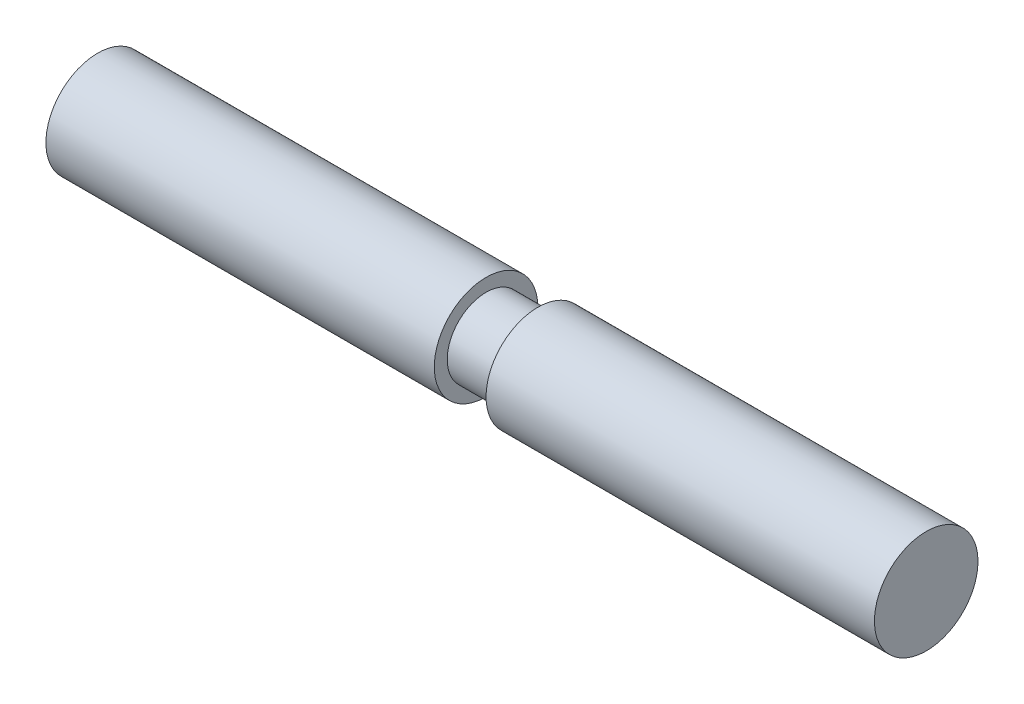
ISO-10303-21;
HEADER;
FILE_DESCRIPTION(('STEP AP214'),'2;1');
FILE_NAME('part.step','',(''),(''),'','','');
FILE_SCHEMA(('AUTOMOTIVE_DESIGN { 1 0 10303 214 1 1 1 1 }'));
ENDSEC;
DATA;
#1=APPLICATION_CONTEXT('core data for automotive mechanical design processes');
#2=APPLICATION_PROTOCOL_DEFINITION('international standard','automotive_design',2000,#1);
#3=PRODUCT_CONTEXT('',#1,'mechanical');
#4=PRODUCT('Part','Part','',(#3));
#5=PRODUCT_RELATED_PRODUCT_CATEGORY('part','',(#4));
#6=PRODUCT_DEFINITION_FORMATION('','',#4);
#7=PRODUCT_DEFINITION_CONTEXT('part definition',#1,'design');
#8=PRODUCT_DEFINITION('design','',#6,#7);
#9=PRODUCT_DEFINITION_SHAPE('','',#8);
#10=(LENGTH_UNIT() NAMED_UNIT(*) SI_UNIT(.MILLI.,.METRE.));
#11=(NAMED_UNIT(*) PLANE_ANGLE_UNIT() SI_UNIT($,.RADIAN.));
#12=(NAMED_UNIT(*) SI_UNIT($,.STERADIAN.) SOLID_ANGLE_UNIT());
#13=UNCERTAINTY_MEASURE_WITH_UNIT(LENGTH_MEASURE(1.E-05),#10,'distance_accuracy_value','');
#14=(GEOMETRIC_REPRESENTATION_CONTEXT(3) GLOBAL_UNCERTAINTY_ASSIGNED_CONTEXT((#13)) GLOBAL_UNIT_ASSIGNED_CONTEXT((#10,
#11,#12)) REPRESENTATION_CONTEXT('',''));
#15=CARTESIAN_POINT('',(0.,0.,0.));
#16=DIRECTION('',(0.,0.,1.));
#17=DIRECTION('',(1.,0.,0.));
#18=AXIS2_PLACEMENT_3D('',#15,#16,#17);
#19=CARTESIAN_POINT('',(-72.,0.,0.));
#20=DIRECTION('',(1.,0.,0.));
#21=DIRECTION('',(0.,0.,-1.));
#22=AXIS2_PLACEMENT_3D('',#19,#20,#21);
#23=CYLINDRICAL_SURFACE('',#22,6.);
#24=CARTESIAN_POINT('',(-72.,0.,0.));
#25=DIRECTION('',(1.,0.,0.));
#26=DIRECTION('',(0.,0.,-1.));
#27=AXIS2_PLACEMENT_3D('',#24,#25,#26);
#28=CIRCLE('',#27,6.);
#29=CARTESIAN_POINT('',(-72.,0.,-6.));
#30=VERTEX_POINT('',#29);
#31=EDGE_CURVE('E10',#30,#30,#28,.T.);
#32=ORIENTED_EDGE('',*,*,#31,.T.);
#33=EDGE_LOOP('',(#32));
#34=FACE_BOUND('',#33,.T.);
#35=CARTESIAN_POINT('',(-27.,0.,0.));
#36=DIRECTION('',(1.,0.,0.));
#37=DIRECTION('',(0.,0.,-1.));
#38=AXIS2_PLACEMENT_3D('',#35,#36,#37);
#39=CIRCLE('',#38,6.);
#40=CARTESIAN_POINT('',(-27.,0.,-6.));
#41=VERTEX_POINT('',#40);
#42=EDGE_CURVE('E35',#41,#41,#39,.F.);
#43=ORIENTED_EDGE('',*,*,#42,.T.);
#44=EDGE_LOOP('',(#43));
#45=FACE_BOUND('',#44,.T.);
#46=ADVANCED_FACE('F31',(#34,#45),#23,.T.);
#47=CARTESIAN_POINT('',(-72.,0.,0.));
#48=DIRECTION('',(1.,0.,0.));
#49=DIRECTION('',(0.,0.,-1.));
#50=AXIS2_PLACEMENT_3D('',#47,#48,#49);
#51=PLANE('',#50);
#52=ORIENTED_EDGE('',*,*,#31,.F.);
#53=EDGE_LOOP('',(#52));
#54=FACE_BOUND('',#53,.T.);
#55=ADVANCED_FACE('F75',(#54),#51,.F.);
#56=CARTESIAN_POINT('',(-27.,0.,0.));
#57=DIRECTION('',(1.,0.,0.));
#58=DIRECTION('',(0.,0.,-1.));
#59=AXIS2_PLACEMENT_3D('',#56,#57,#58);
#60=PLANE('',#59);
#61=ORIENTED_EDGE('',*,*,#42,.F.);
#62=EDGE_LOOP('',(#61));
#63=FACE_BOUND('',#62,.T.);
#64=CARTESIAN_POINT('',(-27.,0.,0.));
#65=DIRECTION('',(1.,0.,0.));
#66=DIRECTION('',(0.,0.,-1.));
#67=AXIS2_PLACEMENT_3D('',#64,#65,#66);
#68=CIRCLE('',#67,4.5);
#69=CARTESIAN_POINT('',(-27.,0.,-4.5));
#70=VERTEX_POINT('',#69);
#71=EDGE_CURVE('E50',#70,#70,#68,.T.);
#72=ORIENTED_EDGE('',*,*,#71,.F.);
#73=EDGE_LOOP('',(#72));
#74=FACE_BOUND('',#73,.T.);
#75=ADVANCED_FACE('F71',(#63,#74),#60,.T.);
#76=CARTESIAN_POINT('',(-21.,0.,0.));
#77=DIRECTION('',(1.,0.,0.));
#78=DIRECTION('',(0.,0.,-1.));
#79=AXIS2_PLACEMENT_3D('',#76,#77,#78);
#80=PLANE('',#79);
#81=CARTESIAN_POINT('',(-21.,0.,0.));
#82=DIRECTION('',(1.,0.,0.));
#83=DIRECTION('',(0.,0.,-1.));
#84=AXIS2_PLACEMENT_3D('',#81,#82,#83);
#85=CIRCLE('',#84,6.);
#86=CARTESIAN_POINT('',(-21.,0.,-6.));
#87=VERTEX_POINT('',#86);
#88=EDGE_CURVE('E48',#87,#87,#85,.F.);
#89=ORIENTED_EDGE('',*,*,#88,.T.);
#90=EDGE_LOOP('',(#89));
#91=FACE_BOUND('',#90,.T.);
#92=CARTESIAN_POINT('',(-21.,0.,0.));
#93=DIRECTION('',(1.,0.,0.));
#94=DIRECTION('',(0.,0.,-1.));
#95=AXIS2_PLACEMENT_3D('',#92,#93,#94);
#96=CIRCLE('',#95,4.5);
#97=CARTESIAN_POINT('',(-21.,0.,-4.5));
#98=VERTEX_POINT('',#97);
#99=EDGE_CURVE('E46',#98,#98,#96,.T.);
#100=ORIENTED_EDGE('',*,*,#99,.T.);
#101=EDGE_LOOP('',(#100));
#102=FACE_BOUND('',#101,.T.);
#103=ADVANCED_FACE('F60',(#91,#102),#80,.F.);
#104=CARTESIAN_POINT('',(-27.,0.,0.));
#105=DIRECTION('',(1.,0.,0.));
#106=DIRECTION('',(0.,0.,-1.));
#107=AXIS2_PLACEMENT_3D('',#104,#105,#106);
#108=CYLINDRICAL_SURFACE('',#107,4.5);
#109=ORIENTED_EDGE('',*,*,#71,.T.);
#110=EDGE_LOOP('',(#109));
#111=FACE_BOUND('',#110,.T.);
#112=ORIENTED_EDGE('',*,*,#99,.F.);
#113=EDGE_LOOP('',(#112));
#114=FACE_BOUND('',#113,.T.);
#115=ADVANCED_FACE('F62',(#111,#114),#108,.T.);
#116=CARTESIAN_POINT('',(24.,0.,0.));
#117=DIRECTION('',(1.,0.,0.));
#118=DIRECTION('',(0.,0.,-1.));
#119=AXIS2_PLACEMENT_3D('',#116,#117,#118);
#120=PLANE('',#119);
#121=CARTESIAN_POINT('',(24.,0.,0.));
#122=DIRECTION('',(1.,0.,0.));
#123=DIRECTION('',(0.,0.,-1.));
#124=AXIS2_PLACEMENT_3D('',#121,#122,#123);
#125=CIRCLE('',#124,6.);
#126=CARTESIAN_POINT('',(24.,0.,-6.));
#127=VERTEX_POINT('',#126);
#128=EDGE_CURVE('E39',#127,#127,#125,.T.);
#129=ORIENTED_EDGE('',*,*,#128,.T.);
#130=EDGE_LOOP('',(#129));
#131=FACE_BOUND('',#130,.T.);
#132=ADVANCED_FACE('F64',(#131),#120,.T.);
#133=ORIENTED_EDGE('',*,*,#88,.F.);
#134=EDGE_LOOP('',(#133));
#135=FACE_BOUND('',#134,.T.);
#136=ORIENTED_EDGE('',*,*,#128,.F.);
#137=EDGE_LOOP('',(#136));
#138=FACE_BOUND('',#137,.T.);
#139=ADVANCED_FACE('F33',(#135,#138),#23,.T.);
#140=CLOSED_SHELL('',(#46,#55,#75,#103,#115,#132,#139));
#141=MANIFOLD_SOLID_BREP('B2',#140);
#142=ADVANCED_BREP_SHAPE_REPRESENTATION('',(#18,#141),#14);
#143=SHAPE_DEFINITION_REPRESENTATION(#9,#142);
ENDSEC;
END-ISO-10303-21;
